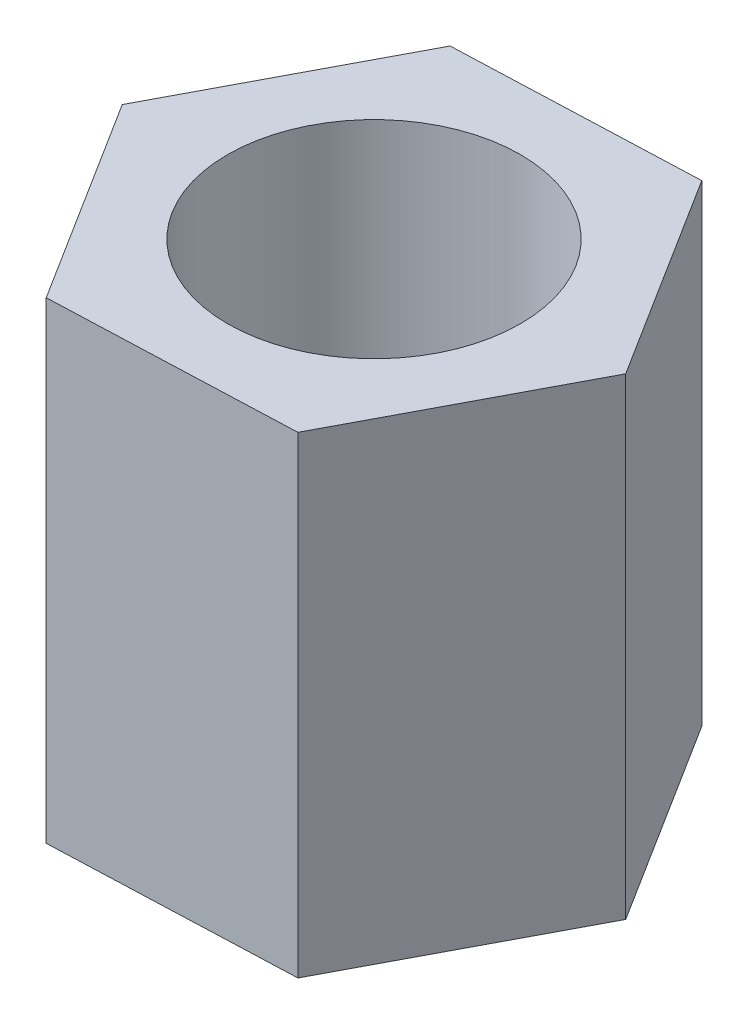
ISO-10303-21;
HEADER;
FILE_DESCRIPTION(('STEP AP214'),'2;1');
FILE_NAME('part.step','',(''),(''),'','','');
FILE_SCHEMA(('AUTOMOTIVE_DESIGN { 1 0 10303 214 1 1 1 1 }'));
ENDSEC;
DATA;
#1=APPLICATION_CONTEXT('core data for automotive mechanical design processes');
#2=APPLICATION_PROTOCOL_DEFINITION('international standard','automotive_design',2000,#1);
#3=PRODUCT_CONTEXT('',#1,'mechanical');
#4=PRODUCT('Part','Part','',(#3));
#5=PRODUCT_RELATED_PRODUCT_CATEGORY('part','',(#4));
#6=PRODUCT_DEFINITION_FORMATION('','',#4);
#7=PRODUCT_DEFINITION_CONTEXT('part definition',#1,'design');
#8=PRODUCT_DEFINITION('design','',#6,#7);
#9=PRODUCT_DEFINITION_SHAPE('','',#8);
#10=(LENGTH_UNIT() NAMED_UNIT(*) SI_UNIT(.MILLI.,.METRE.));
#11=(NAMED_UNIT(*) PLANE_ANGLE_UNIT() SI_UNIT($,.RADIAN.));
#12=(NAMED_UNIT(*) SI_UNIT($,.STERADIAN.) SOLID_ANGLE_UNIT());
#13=UNCERTAINTY_MEASURE_WITH_UNIT(LENGTH_MEASURE(1.E-05),#10,'distance_accuracy_value','');
#14=(GEOMETRIC_REPRESENTATION_CONTEXT(3) GLOBAL_UNCERTAINTY_ASSIGNED_CONTEXT((#13)) GLOBAL_UNIT_ASSIGNED_CONTEXT((#10,
#11,#12)) REPRESENTATION_CONTEXT('',''));
#15=CARTESIAN_POINT('',(0.,0.,0.));
#16=DIRECTION('',(0.,0.,1.));
#17=DIRECTION('',(1.,0.,0.));
#18=AXIS2_PLACEMENT_3D('',#15,#16,#17);
#19=CARTESIAN_POINT('',(0.,5.,0.));
#20=DIRECTION('',(0.,1.,0.));
#21=DIRECTION('',(0.,0.,1.));
#22=AXIS2_PLACEMENT_3D('',#19,#20,#21);
#23=PLANE('',#22);
#24=DIRECTION('',(0.466529456495575,0.,-0.884505662063248));
#25=VECTOR('',#24,1.);
#26=CARTESIAN_POINT('',(1.36762054581552,5.,2.17252239726536));
#27=LINE('',#26,#25);
#28=CARTESIAN_POINT('',(1.36762054581552,5.,2.17252239726536));
#29=VERTEX_POINT('',#28);
#30=CARTESIAN_POINT('',(2.56526985923022,5.,-0.0981329367810983));
#31=VERTEX_POINT('',#30);
#32=EDGE_CURVE('E146',#29,#31,#27,.T.);
#33=ORIENTED_EDGE('',*,*,#32,.T.);
#34=DIRECTION('',(-0.532739644890158,0.,-0.846279191970539));
#35=VECTOR('',#34,1.);
#36=CARTESIAN_POINT('',(2.56526985923022,5.,-0.0981329367810983));
#37=LINE('',#36,#35);
#38=CARTESIAN_POINT('',(1.19764931341471,5.,-2.27065533404645));
#39=VERTEX_POINT('',#38);
#40=EDGE_CURVE('E94',#31,#39,#37,.T.);
#41=ORIENTED_EDGE('',*,*,#40,.T.);
#42=DIRECTION('',(-0.999269101385733,0.,0.0382264700927087));
#43=VECTOR('',#42,1.);
#44=CARTESIAN_POINT('',(1.19764931341471,5.,-2.27065533404645));
#45=LINE('',#44,#43);
#46=CARTESIAN_POINT('',(-1.36762054581551,5.,-2.17252239726535));
#47=VERTEX_POINT('',#46);
#48=EDGE_CURVE('E107',#39,#47,#45,.T.);
#49=ORIENTED_EDGE('',*,*,#48,.T.);
#50=DIRECTION('',(-0.466529456495575,0.,0.884505662063247));
#51=VECTOR('',#50,1.);
#52=CARTESIAN_POINT('',(-1.36762054581551,5.,-2.17252239726535));
#53=LINE('',#52,#51);
#54=CARTESIAN_POINT('',(-2.56526985923022,5.,0.0981329367810979));
#55=VERTEX_POINT('',#54);
#56=EDGE_CURVE('E101',#47,#55,#53,.T.);
#57=ORIENTED_EDGE('',*,*,#56,.T.);
#58=DIRECTION('',(0.532739644890158,0.,0.846279191970539));
#59=VECTOR('',#58,1.);
#60=CARTESIAN_POINT('',(-2.56526985923022,5.,0.0981329367810979));
#61=LINE('',#60,#59);
#62=CARTESIAN_POINT('',(-1.19764931341471,5.,2.27065533404645));
#63=VERTEX_POINT('',#62);
#64=EDGE_CURVE('E105',#55,#63,#61,.T.);
#65=ORIENTED_EDGE('',*,*,#64,.T.);
#66=DIRECTION('',(0.999269101385734,0.,-0.0382264700927087));
#67=VECTOR('',#66,1.);
#68=CARTESIAN_POINT('',(-1.19764931341471,5.,2.27065533404645));
#69=LINE('',#68,#67);
#70=EDGE_CURVE('E57',#63,#29,#69,.T.);
#71=ORIENTED_EDGE('',*,*,#70,.T.);
#72=EDGE_LOOP('',(#33,#41,#49,#57,#65,#71));
#73=FACE_BOUND('',#72,.T.);
#74=CARTESIAN_POINT('',(0.,5.,0.));
#75=DIRECTION('',(0.,1.,0.));
#76=DIRECTION('',(0.,0.,1.));
#77=AXIS2_PLACEMENT_3D('',#74,#75,#76);
#78=CIRCLE('',#77,1.55);
#79=CARTESIAN_POINT('',(0.,5.,1.55));
#80=VERTEX_POINT('',#79);
#81=EDGE_CURVE('E134',#80,#80,#78,.T.);
#82=ORIENTED_EDGE('',*,*,#81,.F.);
#83=EDGE_LOOP('',(#82));
#84=FACE_BOUND('',#83,.T.);
#85=ADVANCED_FACE('F39',(#73,#84),#23,.T.);
#86=CARTESIAN_POINT('',(0.,0.,0.));
#87=DIRECTION('',(0.,1.,0.));
#88=DIRECTION('',(0.,0.,1.));
#89=AXIS2_PLACEMENT_3D('',#86,#87,#88);
#90=PLANE('',#89);
#91=DIRECTION('',(0.466529456495575,0.,-0.884505662063248));
#92=VECTOR('',#91,1.);
#93=CARTESIAN_POINT('',(1.36762054581552,0.,2.17252239726536));
#94=LINE('',#93,#92);
#95=CARTESIAN_POINT('',(1.36762054581552,0.,2.17252239726536));
#96=VERTEX_POINT('',#95);
#97=CARTESIAN_POINT('',(2.56526985923022,0.,-0.0981329367810983));
#98=VERTEX_POINT('',#97);
#99=EDGE_CURVE('E129',#96,#98,#94,.T.);
#100=ORIENTED_EDGE('',*,*,#99,.F.);
#101=DIRECTION('',(0.999269101385734,0.,-0.0382264700927087));
#102=VECTOR('',#101,1.);
#103=CARTESIAN_POINT('',(-1.19764931341471,0.,2.27065533404645));
#104=LINE('',#103,#102);
#105=CARTESIAN_POINT('',(-1.19764931341471,0.,2.27065533404645));
#106=VERTEX_POINT('',#105);
#107=EDGE_CURVE('E86',#106,#96,#104,.T.);
#108=ORIENTED_EDGE('',*,*,#107,.F.);
#109=DIRECTION('',(0.532739644890158,0.,0.846279191970539));
#110=VECTOR('',#109,1.);
#111=CARTESIAN_POINT('',(-2.56526985923022,0.,0.0981329367810979));
#112=LINE('',#111,#110);
#113=CARTESIAN_POINT('',(-2.56526985923022,0.,0.0981329367810979));
#114=VERTEX_POINT('',#113);
#115=EDGE_CURVE('E80',#114,#106,#112,.T.);
#116=ORIENTED_EDGE('',*,*,#115,.F.);
#117=DIRECTION('',(-0.466529456495575,0.,0.884505662063247));
#118=VECTOR('',#117,1.);
#119=CARTESIAN_POINT('',(-1.36762054581551,0.,-2.17252239726535));
#120=LINE('',#119,#118);
#121=CARTESIAN_POINT('',(-1.36762054581551,0.,-2.17252239726535));
#122=VERTEX_POINT('',#121);
#123=EDGE_CURVE('E116',#122,#114,#120,.T.);
#124=ORIENTED_EDGE('',*,*,#123,.F.);
#125=DIRECTION('',(-0.999269101385733,0.,0.0382264700927087));
#126=VECTOR('',#125,1.);
#127=CARTESIAN_POINT('',(1.19764931341471,0.,-2.27065533404645));
#128=LINE('',#127,#126);
#129=CARTESIAN_POINT('',(1.19764931341471,0.,-2.27065533404645));
#130=VERTEX_POINT('',#129);
#131=EDGE_CURVE('E137',#130,#122,#128,.T.);
#132=ORIENTED_EDGE('',*,*,#131,.F.);
#133=DIRECTION('',(-0.532739644890158,0.,-0.846279191970539));
#134=VECTOR('',#133,1.);
#135=CARTESIAN_POINT('',(2.56526985923022,0.,-0.0981329367810983));
#136=LINE('',#135,#134);
#137=EDGE_CURVE('E133',#98,#130,#136,.T.);
#138=ORIENTED_EDGE('',*,*,#137,.F.);
#139=EDGE_LOOP('',(#100,#108,#116,#124,#132,#138));
#140=FACE_BOUND('',#139,.T.);
#141=CARTESIAN_POINT('',(0.,0.,0.));
#142=DIRECTION('',(0.,1.,0.));
#143=DIRECTION('',(0.,0.,1.));
#144=AXIS2_PLACEMENT_3D('',#141,#142,#143);
#145=CIRCLE('',#144,1.55);
#146=CARTESIAN_POINT('',(0.,0.,1.55));
#147=VERTEX_POINT('',#146);
#148=EDGE_CURVE('E243',#147,#147,#145,.T.);
#149=ORIENTED_EDGE('',*,*,#148,.T.);
#150=EDGE_LOOP('',(#149));
#151=FACE_BOUND('',#150,.T.);
#152=ADVANCED_FACE('F159',(#140,#151),#90,.F.);
#153=CARTESIAN_POINT('',(1.36762054581552,5.,2.17252239726536));
#154=DIRECTION('',(-0.884505662063248,0.,-0.466529456495575));
#155=DIRECTION('',(-0.466529456495575,0.,0.884505662063248));
#156=AXIS2_PLACEMENT_3D('',#153,#154,#155);
#157=PLANE('',#156);
#158=ORIENTED_EDGE('',*,*,#99,.T.);
#159=DIRECTION('',(0.,-1.,0.));
#160=VECTOR('',#159,1.);
#161=CARTESIAN_POINT('',(2.56526985923022,5.,-0.0981329367810983));
#162=LINE('',#161,#160);
#163=EDGE_CURVE('E11',#31,#98,#162,.T.);
#164=ORIENTED_EDGE('',*,*,#163,.F.);
#165=ORIENTED_EDGE('',*,*,#32,.F.);
#166=DIRECTION('',(0.,-1.,0.));
#167=VECTOR('',#166,1.);
#168=CARTESIAN_POINT('',(1.36762054581552,5.,2.17252239726536));
#169=LINE('',#168,#167);
#170=EDGE_CURVE('E125',#29,#96,#169,.T.);
#171=ORIENTED_EDGE('',*,*,#170,.T.);
#172=EDGE_LOOP('',(#158,#164,#165,#171));
#173=FACE_BOUND('',#172,.T.);
#174=ADVANCED_FACE('F41',(#173),#157,.F.);
#175=CARTESIAN_POINT('',(2.56526985923022,5.,-0.0981329367810983));
#176=DIRECTION('',(-0.846279191970539,0.,0.532739644890158));
#177=DIRECTION('',(0.532739644890158,0.,0.846279191970539));
#178=AXIS2_PLACEMENT_3D('',#175,#176,#177);
#179=PLANE('',#178);
#180=ORIENTED_EDGE('',*,*,#137,.T.);
#181=DIRECTION('',(0.,-1.,0.));
#182=VECTOR('',#181,1.);
#183=CARTESIAN_POINT('',(1.19764931341471,5.,-2.27065533404645));
#184=LINE('',#183,#182);
#185=EDGE_CURVE('E49',#39,#130,#184,.T.);
#186=ORIENTED_EDGE('',*,*,#185,.F.);
#187=ORIENTED_EDGE('',*,*,#40,.F.);
#188=ORIENTED_EDGE('',*,*,#163,.T.);
#189=EDGE_LOOP('',(#180,#186,#187,#188));
#190=FACE_BOUND('',#189,.T.);
#191=ADVANCED_FACE('F184',(#190),#179,.F.);
#192=CARTESIAN_POINT('',(1.19764931341471,5.,-2.27065533404645));
#193=DIRECTION('',(0.0382264700927087,0.,0.999269101385734));
#194=DIRECTION('',(0.999269101385734,0.,-0.0382264700927087));
#195=AXIS2_PLACEMENT_3D('',#192,#193,#194);
#196=PLANE('',#195);
#197=ORIENTED_EDGE('',*,*,#131,.T.);
#198=DIRECTION('',(0.,-1.,0.));
#199=VECTOR('',#198,1.);
#200=CARTESIAN_POINT('',(-1.36762054581551,5.,-2.17252239726535));
#201=LINE('',#200,#199);
#202=EDGE_CURVE('E118',#47,#122,#201,.T.);
#203=ORIENTED_EDGE('',*,*,#202,.F.);
#204=ORIENTED_EDGE('',*,*,#48,.F.);
#205=ORIENTED_EDGE('',*,*,#185,.T.);
#206=EDGE_LOOP('',(#197,#203,#204,#205));
#207=FACE_BOUND('',#206,.T.);
#208=ADVANCED_FACE('F156',(#207),#196,.F.);
#209=CARTESIAN_POINT('',(-1.36762054581551,5.,-2.17252239726535));
#210=DIRECTION('',(0.884505662063247,0.,0.466529456495575));
#211=DIRECTION('',(0.466529456495575,0.,-0.884505662063247));
#212=AXIS2_PLACEMENT_3D('',#209,#210,#211);
#213=PLANE('',#212);
#214=ORIENTED_EDGE('',*,*,#123,.T.);
#215=DIRECTION('',(0.,-1.,0.));
#216=VECTOR('',#215,1.);
#217=CARTESIAN_POINT('',(-2.56526985923022,5.,0.0981329367810979));
#218=LINE('',#217,#216);
#219=EDGE_CURVE('E113',#55,#114,#218,.T.);
#220=ORIENTED_EDGE('',*,*,#219,.F.);
#221=ORIENTED_EDGE('',*,*,#56,.F.);
#222=ORIENTED_EDGE('',*,*,#202,.T.);
#223=EDGE_LOOP('',(#214,#220,#221,#222));
#224=FACE_BOUND('',#223,.T.);
#225=ADVANCED_FACE('F114',(#224),#213,.F.);
#226=CARTESIAN_POINT('',(-2.56526985923022,5.,0.0981329367810979));
#227=DIRECTION('',(0.846279191970539,0.,-0.532739644890158));
#228=DIRECTION('',(-0.532739644890158,0.,-0.846279191970539));
#229=AXIS2_PLACEMENT_3D('',#226,#227,#228);
#230=PLANE('',#229);
#231=ORIENTED_EDGE('',*,*,#115,.T.);
#232=DIRECTION('',(0.,-1.,0.));
#233=VECTOR('',#232,1.);
#234=CARTESIAN_POINT('',(-1.19764931341471,5.,2.27065533404645));
#235=LINE('',#234,#233);
#236=EDGE_CURVE('E119',#63,#106,#235,.T.);
#237=ORIENTED_EDGE('',*,*,#236,.F.);
#238=ORIENTED_EDGE('',*,*,#64,.F.);
#239=ORIENTED_EDGE('',*,*,#219,.T.);
#240=EDGE_LOOP('',(#231,#237,#238,#239));
#241=FACE_BOUND('',#240,.T.);
#242=ADVANCED_FACE('F121',(#241),#230,.F.);
#243=CARTESIAN_POINT('',(-1.19764931341471,5.,2.27065533404645));
#244=DIRECTION('',(-0.0382264700927087,0.,-0.999269101385734));
#245=DIRECTION('',(-0.999269101385734,0.,0.0382264700927087));
#246=AXIS2_PLACEMENT_3D('',#243,#244,#245);
#247=PLANE('',#246);
#248=ORIENTED_EDGE('',*,*,#107,.T.);
#249=ORIENTED_EDGE('',*,*,#170,.F.);
#250=ORIENTED_EDGE('',*,*,#70,.F.);
#251=ORIENTED_EDGE('',*,*,#236,.T.);
#252=EDGE_LOOP('',(#248,#249,#250,#251));
#253=FACE_BOUND('',#252,.T.);
#254=ADVANCED_FACE('F164',(#253),#247,.F.);
#255=CARTESIAN_POINT('',(0.,5.,0.));
#256=DIRECTION('',(0.,-1.,0.));
#257=DIRECTION('',(0.,0.,-1.));
#258=AXIS2_PLACEMENT_3D('',#255,#256,#257);
#259=CYLINDRICAL_SURFACE('',#258,1.55);
#260=ORIENTED_EDGE('',*,*,#81,.T.);
#261=EDGE_LOOP('',(#260));
#262=FACE_BOUND('',#261,.T.);
#263=ORIENTED_EDGE('',*,*,#148,.F.);
#264=EDGE_LOOP('',(#263));
#265=FACE_BOUND('',#264,.T.);
#266=ADVANCED_FACE('F166',(#262,#265),#259,.F.);
#267=CLOSED_SHELL('',(#85,#152,#174,#191,#208,#225,#242,#254,#266));
#268=MANIFOLD_SOLID_BREP('B2',#267);
#269=ADVANCED_BREP_SHAPE_REPRESENTATION('',(#18,#268),#14);
#270=SHAPE_DEFINITION_REPRESENTATION(#9,#269);
ENDSEC;
END-ISO-10303-21;
